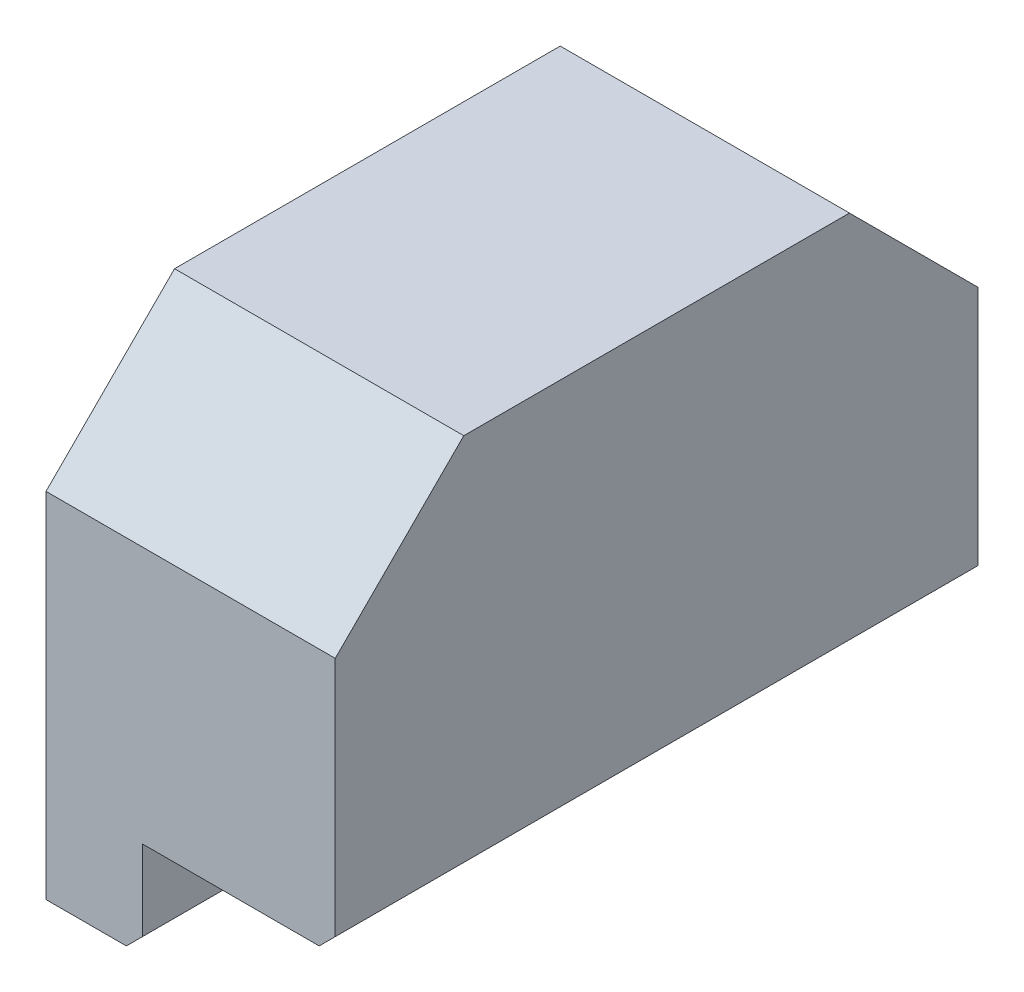
ISO-10303-21;
HEADER;
FILE_DESCRIPTION(('STEP AP214'),'2;1');
FILE_NAME('part.step','',(''),(''),'','','');
FILE_SCHEMA(('AUTOMOTIVE_DESIGN { 1 0 10303 214 1 1 1 1 }'));
ENDSEC;
DATA;
#1=APPLICATION_CONTEXT('core data for automotive mechanical design processes');
#2=APPLICATION_PROTOCOL_DEFINITION('international standard','automotive_design',2000,#1);
#3=PRODUCT_CONTEXT('',#1,'mechanical');
#4=PRODUCT('Part','Part','',(#3));
#5=PRODUCT_RELATED_PRODUCT_CATEGORY('part','',(#4));
#6=PRODUCT_DEFINITION_FORMATION('','',#4);
#7=PRODUCT_DEFINITION_CONTEXT('part definition',#1,'design');
#8=PRODUCT_DEFINITION('design','',#6,#7);
#9=PRODUCT_DEFINITION_SHAPE('','',#8);
#10=(LENGTH_UNIT() NAMED_UNIT(*) SI_UNIT(.MILLI.,.METRE.));
#11=(NAMED_UNIT(*) PLANE_ANGLE_UNIT() SI_UNIT($,.RADIAN.));
#12=(NAMED_UNIT(*) SI_UNIT($,.STERADIAN.) SOLID_ANGLE_UNIT());
#13=UNCERTAINTY_MEASURE_WITH_UNIT(LENGTH_MEASURE(1.E-05),#10,'distance_accuracy_value','');
#14=(GEOMETRIC_REPRESENTATION_CONTEXT(3) GLOBAL_UNCERTAINTY_ASSIGNED_CONTEXT((#13)) GLOBAL_UNIT_ASSIGNED_CONTEXT((#10,
#11,#12)) REPRESENTATION_CONTEXT('',''));
#15=CARTESIAN_POINT('',(0.,0.,0.));
#16=DIRECTION('',(0.,0.,1.));
#17=DIRECTION('',(1.,0.,0.));
#18=AXIS2_PLACEMENT_3D('',#15,#16,#17);
#19=CARTESIAN_POINT('',(0.,0.,20.));
#20=DIRECTION('',(0.,1.,0.));
#21=DIRECTION('',(-1.,0.,0.));
#22=AXIS2_PLACEMENT_3D('',#19,#20,#21);
#23=PLANE('',#22);
#24=DIRECTION('',(1.,0.,0.));
#25=VECTOR('',#24,1.);
#26=CARTESIAN_POINT('',(0.,0.,0.));
#27=LINE('',#26,#25);
#28=CARTESIAN_POINT('',(-3.,0.,0.));
#29=VERTEX_POINT('',#28);
#30=CARTESIAN_POINT('',(-0.5,0.,0.));
#31=VERTEX_POINT('',#30);
#32=EDGE_CURVE('E149',#29,#31,#27,.T.);
#33=ORIENTED_EDGE('',*,*,#32,.T.);
#34=DIRECTION('',(0.,0.,1.));
#35=VECTOR('',#34,1.);
#36=CARTESIAN_POINT('',(-0.5,0.,20.));
#37=LINE('',#36,#35);
#38=CARTESIAN_POINT('',(-0.5,0.,20.));
#39=VERTEX_POINT('',#38);
#40=EDGE_CURVE('E216',#31,#39,#37,.T.);
#41=ORIENTED_EDGE('',*,*,#40,.T.);
#42=DIRECTION('',(1.,0.,0.));
#43=VECTOR('',#42,1.);
#44=CARTESIAN_POINT('',(0.,0.,20.));
#45=LINE('',#44,#43);
#46=CARTESIAN_POINT('',(-3.,0.,20.));
#47=VERTEX_POINT('',#46);
#48=EDGE_CURVE('E150',#47,#39,#45,.T.);
#49=ORIENTED_EDGE('',*,*,#48,.F.);
#50=DIRECTION('',(0.,0.,-1.));
#51=VECTOR('',#50,1.);
#52=CARTESIAN_POINT('',(-3.,0.,20.));
#53=LINE('',#52,#51);
#54=EDGE_CURVE('E162',#47,#29,#53,.T.);
#55=ORIENTED_EDGE('',*,*,#54,.T.);
#56=EDGE_LOOP('',(#33,#41,#49,#55));
#57=FACE_BOUND('',#56,.T.);
#58=ADVANCED_FACE('F39',(#57),#23,.F.);
#59=CARTESIAN_POINT('',(0.,3.,20.));
#60=DIRECTION('',(-1.,0.,0.));
#61=DIRECTION('',(0.,0.,1.));
#62=AXIS2_PLACEMENT_3D('',#59,#60,#61);
#63=PLANE('',#62);
#64=DIRECTION('',(0.,1.,0.));
#65=VECTOR('',#64,1.);
#66=CARTESIAN_POINT('',(0.,3.,20.));
#67=LINE('',#66,#65);
#68=CARTESIAN_POINT('',(0.,0.499999999999997,20.));
#69=VERTEX_POINT('',#68);
#70=CARTESIAN_POINT('',(0.,3.,20.));
#71=VERTEX_POINT('',#70);
#72=EDGE_CURVE('E153',#69,#71,#67,.T.);
#73=ORIENTED_EDGE('',*,*,#72,.F.);
#74=DIRECTION('',(0.,0.,-1.));
#75=VECTOR('',#74,1.);
#76=CARTESIAN_POINT('',(0.,0.499999999999997,20.));
#77=LINE('',#76,#75);
#78=CARTESIAN_POINT('',(0.,0.499999999999997,0.));
#79=VERTEX_POINT('',#78);
#80=EDGE_CURVE('E209',#69,#79,#77,.T.);
#81=ORIENTED_EDGE('',*,*,#80,.T.);
#82=DIRECTION('',(0.,1.,0.));
#83=VECTOR('',#82,1.);
#84=CARTESIAN_POINT('',(0.,3.,0.));
#85=LINE('',#84,#83);
#86=CARTESIAN_POINT('',(0.,3.,0.));
#87=VERTEX_POINT('',#86);
#88=EDGE_CURVE('E165',#79,#87,#85,.T.);
#89=ORIENTED_EDGE('',*,*,#88,.T.);
#90=DIRECTION('',(0.,0.,-1.));
#91=VECTOR('',#90,1.);
#92=CARTESIAN_POINT('',(0.,3.,20.));
#93=LINE('',#92,#91);
#94=EDGE_CURVE('E180',#71,#87,#93,.T.);
#95=ORIENTED_EDGE('',*,*,#94,.F.);
#96=EDGE_LOOP('',(#73,#81,#89,#95));
#97=FACE_BOUND('',#96,.T.);
#98=ADVANCED_FACE('F244',(#97),#63,.F.);
#99=CARTESIAN_POINT('',(0.,3.,20.));
#100=DIRECTION('',(0.,1.,0.));
#101=DIRECTION('',(0.,0.,1.));
#102=AXIS2_PLACEMENT_3D('',#99,#100,#101);
#103=PLANE('',#102);
#104=CARTESIAN_POINT('',(2.5,3.,5.));
#105=DIRECTION('',(0.,-1.,0.));
#106=DIRECTION('',(0.,0.,-1.));
#107=AXIS2_PLACEMENT_3D('',#104,#105,#106);
#108=CIRCLE('',#107,1.24999999999999);
#109=CARTESIAN_POINT('',(2.5,3.,3.75000000000001));
#110=VERTEX_POINT('',#109);
#111=EDGE_CURVE('E133',#110,#110,#108,.T.);
#112=ORIENTED_EDGE('',*,*,#111,.F.);
#113=EDGE_LOOP('',(#112));
#114=FACE_BOUND('',#113,.T.);
#115=CARTESIAN_POINT('',(2.5,3.,15.));
#116=DIRECTION('',(0.,-1.,0.));
#117=DIRECTION('',(0.,0.,-1.));
#118=AXIS2_PLACEMENT_3D('',#115,#116,#117);
#119=CIRCLE('',#118,1.24999999999999);
#120=CARTESIAN_POINT('',(2.5,3.,13.75));
#121=VERTEX_POINT('',#120);
#122=EDGE_CURVE('E132',#121,#121,#119,.T.);
#123=ORIENTED_EDGE('',*,*,#122,.F.);
#124=EDGE_LOOP('',(#123));
#125=FACE_BOUND('',#124,.T.);
#126=DIRECTION('',(1.,0.,0.));
#127=VECTOR('',#126,1.);
#128=CARTESIAN_POINT('',(0.,3.,0.));
#129=LINE('',#128,#127);
#130=CARTESIAN_POINT('',(5.5,3.,0.));
#131=VERTEX_POINT('',#130);
#132=EDGE_CURVE('E167',#87,#131,#129,.T.);
#133=ORIENTED_EDGE('',*,*,#132,.T.);
#134=DIRECTION('',(0.,0.,1.));
#135=VECTOR('',#134,1.);
#136=CARTESIAN_POINT('',(5.5,3.,20.));
#137=LINE('',#136,#135);
#138=CARTESIAN_POINT('',(5.5,3.,20.));
#139=VERTEX_POINT('',#138);
#140=EDGE_CURVE('E54',#131,#139,#137,.T.);
#141=ORIENTED_EDGE('',*,*,#140,.T.);
#142=DIRECTION('',(1.,0.,0.));
#143=VECTOR('',#142,1.);
#144=CARTESIAN_POINT('',(0.,3.,20.));
#145=LINE('',#144,#143);
#146=EDGE_CURVE('E156',#71,#139,#145,.T.);
#147=ORIENTED_EDGE('',*,*,#146,.F.);
#148=ORIENTED_EDGE('',*,*,#94,.T.);
#149=EDGE_LOOP('',(#133,#141,#147,#148));
#150=FACE_BOUND('',#149,.T.);
#151=ADVANCED_FACE('F250',(#114,#125,#150),#103,.F.);
#152=CARTESIAN_POINT('',(6.,3.,20.));
#153=DIRECTION('',(-1.,0.,0.));
#154=DIRECTION('',(0.,0.,1.));
#155=AXIS2_PLACEMENT_3D('',#152,#153,#154);
#156=PLANE('',#155);
#157=DIRECTION('',(0.,1.,0.));
#158=VECTOR('',#157,1.);
#159=CARTESIAN_POINT('',(6.,3.,20.));
#160=LINE('',#159,#158);
#161=CARTESIAN_POINT('',(6.,3.5,20.));
#162=VERTEX_POINT('',#161);
#163=CARTESIAN_POINT('',(6.,11.,20.));
#164=VERTEX_POINT('',#163);
#165=EDGE_CURVE('E158',#162,#164,#160,.T.);
#166=ORIENTED_EDGE('',*,*,#165,.F.);
#167=DIRECTION('',(0.,0.,-1.));
#168=VECTOR('',#167,1.);
#169=CARTESIAN_POINT('',(6.,3.5,20.));
#170=LINE('',#169,#168);
#171=CARTESIAN_POINT('',(6.,3.5,0.));
#172=VERTEX_POINT('',#171);
#173=EDGE_CURVE('E221',#162,#172,#170,.T.);
#174=ORIENTED_EDGE('',*,*,#173,.T.);
#175=DIRECTION('',(0.,1.,0.));
#176=VECTOR('',#175,1.);
#177=CARTESIAN_POINT('',(6.,3.,0.));
#178=LINE('',#177,#176);
#179=CARTESIAN_POINT('',(6.,11.,0.));
#180=VERTEX_POINT('',#179);
#181=EDGE_CURVE('E169',#172,#180,#178,.T.);
#182=ORIENTED_EDGE('',*,*,#181,.T.);
#183=DIRECTION('',(0.,-0.707106781186549,-0.707106781186546));
#184=VECTOR('',#183,1.);
#185=CARTESIAN_POINT('',(6.,15.,4.));
#186=LINE('',#185,#184);
#187=CARTESIAN_POINT('',(6.,15.,4.));
#188=VERTEX_POINT('',#187);
#189=EDGE_CURVE('E195',#180,#188,#186,.F.);
#190=ORIENTED_EDGE('',*,*,#189,.T.);
#191=DIRECTION('',(0.,0.,-1.));
#192=VECTOR('',#191,1.);
#193=CARTESIAN_POINT('',(6.,15.,20.));
#194=LINE('',#193,#192);
#195=CARTESIAN_POINT('',(6.,15.,16.));
#196=VERTEX_POINT('',#195);
#197=EDGE_CURVE('E177',#196,#188,#194,.T.);
#198=ORIENTED_EDGE('',*,*,#197,.F.);
#199=DIRECTION('',(0.,-0.707106781186546,0.707106781186549));
#200=VECTOR('',#199,1.);
#201=CARTESIAN_POINT('',(6.,11.,20.));
#202=LINE('',#201,#200);
#203=EDGE_CURVE('E197',#196,#164,#202,.T.);
#204=ORIENTED_EDGE('',*,*,#203,.T.);
#205=EDGE_LOOP('',(#166,#174,#182,#190,#198,#204));
#206=FACE_BOUND('',#205,.T.);
#207=ADVANCED_FACE('F284',(#206),#156,.F.);
#208=CARTESIAN_POINT('',(6.,15.,20.));
#209=DIRECTION('',(0.,-1.,0.));
#210=DIRECTION('',(1.,0.,0.));
#211=AXIS2_PLACEMENT_3D('',#208,#209,#210);
#212=PLANE('',#211);
#213=DIRECTION('',(0.,0.,-1.));
#214=VECTOR('',#213,1.);
#215=CARTESIAN_POINT('',(-3.,15.,20.));
#216=LINE('',#215,#214);
#217=CARTESIAN_POINT('',(-3.,15.,16.));
#218=VERTEX_POINT('',#217);
#219=CARTESIAN_POINT('',(-3.,15.,4.));
#220=VERTEX_POINT('',#219);
#221=EDGE_CURVE('E174',#218,#220,#216,.T.);
#222=ORIENTED_EDGE('',*,*,#221,.F.);
#223=DIRECTION('',(1.,0.,0.));
#224=VECTOR('',#223,1.);
#225=CARTESIAN_POINT('',(6.,15.,16.));
#226=LINE('',#225,#224);
#227=EDGE_CURVE('E193',#218,#196,#226,.T.);
#228=ORIENTED_EDGE('',*,*,#227,.T.);
#229=ORIENTED_EDGE('',*,*,#197,.T.);
#230=DIRECTION('',(-1.,0.,0.));
#231=VECTOR('',#230,1.);
#232=CARTESIAN_POINT('',(6.,15.,4.));
#233=LINE('',#232,#231);
#234=EDGE_CURVE('E190',#188,#220,#233,.T.);
#235=ORIENTED_EDGE('',*,*,#234,.T.);
#236=EDGE_LOOP('',(#222,#228,#229,#235));
#237=FACE_BOUND('',#236,.T.);
#238=ADVANCED_FACE('F296',(#237),#212,.F.);
#239=CARTESIAN_POINT('',(-3.,15.,20.));
#240=DIRECTION('',(1.,0.,0.));
#241=DIRECTION('',(0.,1.,0.));
#242=AXIS2_PLACEMENT_3D('',#239,#240,#241);
#243=PLANE('',#242);
#244=CARTESIAN_POINT('',(-3.,9.,10.));
#245=DIRECTION('',(1.,0.,0.));
#246=DIRECTION('',(0.,1.,0.));
#247=AXIS2_PLACEMENT_3D('',#244,#245,#246);
#248=CIRCLE('',#247,5.5);
#249=CARTESIAN_POINT('',(-3.,14.5,10.));
#250=VERTEX_POINT('',#249);
#251=EDGE_CURVE('E11',#250,#250,#248,.T.);
#252=ORIENTED_EDGE('',*,*,#251,.T.);
#253=EDGE_LOOP('',(#252));
#254=FACE_BOUND('',#253,.T.);
#255=DIRECTION('',(0.,-1.,0.));
#256=VECTOR('',#255,1.);
#257=CARTESIAN_POINT('',(-3.,15.,20.));
#258=LINE('',#257,#256);
#259=CARTESIAN_POINT('',(-3.,11.,20.));
#260=VERTEX_POINT('',#259);
#261=EDGE_CURVE('E160',#260,#47,#258,.T.);
#262=ORIENTED_EDGE('',*,*,#261,.F.);
#263=DIRECTION('',(0.,0.707106781186546,-0.707106781186549));
#264=VECTOR('',#263,1.);
#265=CARTESIAN_POINT('',(-3.,11.,20.));
#266=LINE('',#265,#264);
#267=EDGE_CURVE('E188',#260,#218,#266,.T.);
#268=ORIENTED_EDGE('',*,*,#267,.T.);
#269=ORIENTED_EDGE('',*,*,#221,.T.);
#270=DIRECTION('',(0.,0.707106781186549,0.707106781186546));
#271=VECTOR('',#270,1.);
#272=CARTESIAN_POINT('',(-3.,15.,4.));
#273=LINE('',#272,#271);
#274=CARTESIAN_POINT('',(-3.,11.,0.));
#275=VERTEX_POINT('',#274);
#276=EDGE_CURVE('E186',#220,#275,#273,.F.);
#277=ORIENTED_EDGE('',*,*,#276,.T.);
#278=DIRECTION('',(0.,-1.,0.));
#279=VECTOR('',#278,1.);
#280=CARTESIAN_POINT('',(-3.,15.,0.));
#281=LINE('',#280,#279);
#282=EDGE_CURVE('E154',#275,#29,#281,.T.);
#283=ORIENTED_EDGE('',*,*,#282,.T.);
#284=ORIENTED_EDGE('',*,*,#54,.F.);
#285=EDGE_LOOP('',(#262,#268,#269,#277,#283,#284));
#286=FACE_BOUND('',#285,.T.);
#287=ADVANCED_FACE('F302',(#254,#286),#243,.F.);
#288=CARTESIAN_POINT('',(0.,0.,20.));
#289=DIRECTION('',(0.,0.,1.));
#290=DIRECTION('',(1.,0.,0.));
#291=AXIS2_PLACEMENT_3D('',#288,#289,#290);
#292=PLANE('',#291);
#293=ORIENTED_EDGE('',*,*,#48,.T.);
#294=DIRECTION('',(-0.70710678118655,-0.707106781186545,0.));
#295=VECTOR('',#294,1.);
#296=CARTESIAN_POINT('',(-0.249999999999999,0.25,20.));
#297=LINE('',#296,#295);
#298=EDGE_CURVE('E219',#39,#69,#297,.F.);
#299=ORIENTED_EDGE('',*,*,#298,.T.);
#300=ORIENTED_EDGE('',*,*,#72,.T.);
#301=ORIENTED_EDGE('',*,*,#146,.T.);
#302=DIRECTION('',(-0.70710678118655,-0.707106781186545,0.));
#303=VECTOR('',#302,1.);
#304=CARTESIAN_POINT('',(1.24999999999998,-1.24999999999999,20.));
#305=LINE('',#304,#303);
#306=EDGE_CURVE('E61',#139,#162,#305,.F.);
#307=ORIENTED_EDGE('',*,*,#306,.T.);
#308=ORIENTED_EDGE('',*,*,#165,.T.);
#309=DIRECTION('',(-1.,0.,0.));
#310=VECTOR('',#309,1.);
#311=CARTESIAN_POINT('',(-3.,11.,20.));
#312=LINE('',#311,#310);
#313=EDGE_CURVE('E183',#164,#260,#312,.T.);
#314=ORIENTED_EDGE('',*,*,#313,.T.);
#315=ORIENTED_EDGE('',*,*,#261,.T.);
#316=EDGE_LOOP('',(#293,#299,#300,#301,#307,#308,#314,#315));
#317=FACE_BOUND('',#316,.T.);
#318=ADVANCED_FACE('F276',(#317),#292,.T.);
#319=CARTESIAN_POINT('',(0.,0.,0.));
#320=DIRECTION('',(0.,0.,1.));
#321=DIRECTION('',(1.,0.,0.));
#322=AXIS2_PLACEMENT_3D('',#319,#320,#321);
#323=PLANE('',#322);
#324=ORIENTED_EDGE('',*,*,#88,.F.);
#325=DIRECTION('',(0.70710678118655,0.707106781186545,0.));
#326=VECTOR('',#325,1.);
#327=CARTESIAN_POINT('',(0.,0.499999999999997,0.));
#328=LINE('',#327,#326);
#329=EDGE_CURVE('E214',#79,#31,#328,.F.);
#330=ORIENTED_EDGE('',*,*,#329,.T.);
#331=ORIENTED_EDGE('',*,*,#32,.F.);
#332=ORIENTED_EDGE('',*,*,#282,.F.);
#333=DIRECTION('',(1.,0.,0.));
#334=VECTOR('',#333,1.);
#335=CARTESIAN_POINT('',(0.,11.,0.));
#336=LINE('',#335,#334);
#337=EDGE_CURVE('E200',#275,#180,#336,.T.);
#338=ORIENTED_EDGE('',*,*,#337,.T.);
#339=ORIENTED_EDGE('',*,*,#181,.F.);
#340=DIRECTION('',(0.70710678118655,0.707106781186545,0.));
#341=VECTOR('',#340,1.);
#342=CARTESIAN_POINT('',(6.,3.5,0.));
#343=LINE('',#342,#341);
#344=EDGE_CURVE('E212',#172,#131,#343,.F.);
#345=ORIENTED_EDGE('',*,*,#344,.T.);
#346=ORIENTED_EDGE('',*,*,#132,.F.);
#347=EDGE_LOOP('',(#324,#330,#331,#332,#338,#339,#345,#346));
#348=FACE_BOUND('',#347,.T.);
#349=ADVANCED_FACE('F286',(#348),#323,.F.);
#350=CARTESIAN_POINT('',(-1.,9.,10.));
#351=DIRECTION('',(-1.,0.,0.));
#352=DIRECTION('',(0.,-1.,0.));
#353=AXIS2_PLACEMENT_3D('',#350,#351,#352);
#354=CYLINDRICAL_SURFACE('',#353,5.);
#355=CARTESIAN_POINT('',(-2.50000000000001,9.,10.));
#356=DIRECTION('',(1.,0.,0.));
#357=DIRECTION('',(0.,0.,-1.));
#358=AXIS2_PLACEMENT_3D('',#355,#356,#357);
#359=CIRCLE('',#358,5.);
#360=CARTESIAN_POINT('',(-2.50000000000001,9.,5.));
#361=VERTEX_POINT('',#360);
#362=EDGE_CURVE('E47',#361,#361,#359,.F.);
#363=ORIENTED_EDGE('',*,*,#362,.T.);
#364=EDGE_LOOP('',(#363));
#365=FACE_BOUND('',#364,.T.);
#366=CARTESIAN_POINT('',(-1.,9.,10.));
#367=DIRECTION('',(-1.,0.,0.));
#368=DIRECTION('',(0.,-1.,0.));
#369=AXIS2_PLACEMENT_3D('',#366,#367,#368);
#370=CIRCLE('',#369,5.);
#371=CARTESIAN_POINT('',(-1.,4.,10.));
#372=VERTEX_POINT('',#371);
#373=EDGE_CURVE('E146',#372,#372,#370,.T.);
#374=ORIENTED_EDGE('',*,*,#373,.F.);
#375=EDGE_LOOP('',(#374));
#376=FACE_BOUND('',#375,.T.);
#377=ADVANCED_FACE('F227',(#365,#376),#354,.F.);
#378=CARTESIAN_POINT('',(-1.,9.,10.));
#379=DIRECTION('',(-1.,0.,0.));
#380=DIRECTION('',(0.,-1.,0.));
#381=AXIS2_PLACEMENT_3D('',#378,#379,#380);
#382=PLANE('',#381);
#383=CARTESIAN_POINT('',(-1.,9.,10.));
#384=DIRECTION('',(-1.,0.,0.));
#385=DIRECTION('',(0.,-1.,0.));
#386=AXIS2_PLACEMENT_3D('',#383,#384,#385);
#387=CIRCLE('',#386,2.);
#388=CARTESIAN_POINT('',(-1.,7.,10.));
#389=VERTEX_POINT('',#388);
#390=EDGE_CURVE('E143',#389,#389,#387,.T.);
#391=ORIENTED_EDGE('',*,*,#390,.F.);
#392=EDGE_LOOP('',(#391));
#393=FACE_BOUND('',#392,.T.);
#394=ORIENTED_EDGE('',*,*,#373,.T.);
#395=EDGE_LOOP('',(#394));
#396=FACE_BOUND('',#395,.T.);
#397=ADVANCED_FACE('F319',(#393,#396),#382,.T.);
#398=CARTESIAN_POINT('',(-1.,9.,10.));
#399=DIRECTION('',(-1.,0.,0.));
#400=DIRECTION('',(0.,-1.,0.));
#401=AXIS2_PLACEMENT_3D('',#398,#399,#400);
#402=CYLINDRICAL_SURFACE('',#401,2.);
#403=CARTESIAN_POINT('',(-2.5,9.,10.));
#404=DIRECTION('',(1.,0.,0.));
#405=DIRECTION('',(0.,0.,-1.));
#406=AXIS2_PLACEMENT_3D('',#403,#404,#405);
#407=CIRCLE('',#406,2.);
#408=CARTESIAN_POINT('',(-2.5,9.,8.));
#409=VERTEX_POINT('',#408);
#410=EDGE_CURVE('E206',#409,#409,#407,.T.);
#411=ORIENTED_EDGE('',*,*,#410,.T.);
#412=EDGE_LOOP('',(#411));
#413=FACE_BOUND('',#412,.T.);
#414=ORIENTED_EDGE('',*,*,#390,.T.);
#415=EDGE_LOOP('',(#414));
#416=FACE_BOUND('',#415,.T.);
#417=ADVANCED_FACE('F314',(#413,#416),#402,.T.);
#418=CARTESIAN_POINT('',(-3.,9.,10.));
#419=DIRECTION('',(1.,0.,0.));
#420=DIRECTION('',(0.,1.,0.));
#421=AXIS2_PLACEMENT_3D('',#418,#419,#420);
#422=CIRCLE('',#421,1.5);
#423=CARTESIAN_POINT('',(-3.,10.5,10.));
#424=VERTEX_POINT('',#423);
#425=EDGE_CURVE('E203',#424,#424,#422,.F.);
#426=ORIENTED_EDGE('',*,*,#425,.T.);
#427=EDGE_LOOP('',(#426));
#428=FACE_BOUND('',#427,.T.);
#429=ADVANCED_FACE('F259',(#428),#243,.F.);
#430=CARTESIAN_POINT('',(0.,11.,20.));
#431=DIRECTION('',(0.,0.707106781186549,0.707106781186546));
#432=DIRECTION('',(1.,0.,0.));
#433=AXIS2_PLACEMENT_3D('',#430,#431,#432);
#434=PLANE('',#433);
#435=ORIENTED_EDGE('',*,*,#203,.F.);
#436=ORIENTED_EDGE('',*,*,#227,.F.);
#437=ORIENTED_EDGE('',*,*,#267,.F.);
#438=ORIENTED_EDGE('',*,*,#313,.F.);
#439=EDGE_LOOP('',(#435,#436,#437,#438));
#440=FACE_BOUND('',#439,.T.);
#441=ADVANCED_FACE('F255',(#440),#434,.T.);
#442=CARTESIAN_POINT('',(6.,15.,4.));
#443=DIRECTION('',(0.,-0.707106781186546,0.707106781186549));
#444=DIRECTION('',(-1.,0.,0.));
#445=AXIS2_PLACEMENT_3D('',#442,#443,#444);
#446=PLANE('',#445);
#447=ORIENTED_EDGE('',*,*,#189,.F.);
#448=ORIENTED_EDGE('',*,*,#337,.F.);
#449=ORIENTED_EDGE('',*,*,#276,.F.);
#450=ORIENTED_EDGE('',*,*,#234,.F.);
#451=EDGE_LOOP('',(#447,#448,#449,#450));
#452=FACE_BOUND('',#451,.T.);
#453=ADVANCED_FACE('F258',(#452),#446,.F.);
#454=CARTESIAN_POINT('',(-3.,9.,10.));
#455=DIRECTION('',(1.,0.,0.));
#456=DIRECTION('',(0.,0.,-1.));
#457=AXIS2_PLACEMENT_3D('',#454,#455,#456);
#458=CONICAL_SURFACE('',#457,1.5,0.785398163397448);
#459=ORIENTED_EDGE('',*,*,#410,.F.);
#460=EDGE_LOOP('',(#459));
#461=FACE_BOUND('',#460,.T.);
#462=ORIENTED_EDGE('',*,*,#425,.F.);
#463=EDGE_LOOP('',(#462));
#464=FACE_BOUND('',#463,.T.);
#465=ADVANCED_FACE('F263',(#461,#464),#458,.T.);
#466=CARTESIAN_POINT('',(0.,0.499999999999997,20.));
#467=DIRECTION('',(-0.707106781186545,0.70710678118655,0.));
#468=DIRECTION('',(0.,0.,-1.));
#469=AXIS2_PLACEMENT_3D('',#466,#467,#468);
#470=PLANE('',#469);
#471=ORIENTED_EDGE('',*,*,#298,.F.);
#472=ORIENTED_EDGE('',*,*,#40,.F.);
#473=ORIENTED_EDGE('',*,*,#329,.F.);
#474=ORIENTED_EDGE('',*,*,#80,.F.);
#475=EDGE_LOOP('',(#471,#472,#473,#474));
#476=FACE_BOUND('',#475,.T.);
#477=ADVANCED_FACE('F240',(#476),#470,.F.);
#478=CARTESIAN_POINT('',(6.,3.5,20.));
#479=DIRECTION('',(-0.707106781186545,0.70710678118655,0.));
#480=DIRECTION('',(0.,0.,-1.));
#481=AXIS2_PLACEMENT_3D('',#478,#479,#480);
#482=PLANE('',#481);
#483=ORIENTED_EDGE('',*,*,#306,.F.);
#484=ORIENTED_EDGE('',*,*,#140,.F.);
#485=ORIENTED_EDGE('',*,*,#344,.F.);
#486=ORIENTED_EDGE('',*,*,#173,.F.);
#487=EDGE_LOOP('',(#483,#484,#485,#486));
#488=FACE_BOUND('',#487,.T.);
#489=ADVANCED_FACE('F232',(#488),#482,.F.);
#490=CARTESIAN_POINT('',(-2.50000000000001,9.,10.));
#491=DIRECTION('',(-1.,0.,0.));
#492=DIRECTION('',(0.,0.,1.));
#493=AXIS2_PLACEMENT_3D('',#490,#491,#492);
#494=CONICAL_SURFACE('',#493,5.,0.785398163397456);
#495=ORIENTED_EDGE('',*,*,#251,.F.);
#496=EDGE_LOOP('',(#495));
#497=FACE_BOUND('',#496,.T.);
#498=ORIENTED_EDGE('',*,*,#362,.F.);
#499=EDGE_LOOP('',(#498));
#500=FACE_BOUND('',#499,.T.);
#501=ADVANCED_FACE('F41',(#497,#500),#494,.F.);
#502=CARTESIAN_POINT('',(2.5,10.5,15.));
#503=DIRECTION('',(0.,-1.,0.));
#504=DIRECTION('',(0.,0.,-1.));
#505=AXIS2_PLACEMENT_3D('',#502,#503,#504);
#506=CONICAL_SURFACE('',#505,1.24999999999999,1.02974425867664);
#507=CARTESIAN_POINT('',(2.5,11.2510757737845,15.));
#508=VERTEX_POINT('',#507);
#509=VERTEX_LOOP('',#508);
#510=FACE_BOUND('',#509,.T.);
#511=CARTESIAN_POINT('',(2.5,10.5,15.));
#512=DIRECTION('',(0.,-1.,0.));
#513=DIRECTION('',(0.,0.,-1.));
#514=AXIS2_PLACEMENT_3D('',#511,#512,#513);
#515=CIRCLE('',#514,1.24999999999999);
#516=CARTESIAN_POINT('',(2.5,10.5,13.75));
#517=VERTEX_POINT('',#516);
#518=EDGE_CURVE('E136',#517,#517,#515,.T.);
#519=ORIENTED_EDGE('',*,*,#518,.T.);
#520=EDGE_LOOP('',(#519));
#521=FACE_BOUND('',#520,.T.);
#522=ADVANCED_FACE('F231',(#510,#521),#506,.F.);
#523=CARTESIAN_POINT('',(2.5,3.,15.));
#524=DIRECTION('',(0.,-1.,0.));
#525=DIRECTION('',(0.,0.,-1.));
#526=AXIS2_PLACEMENT_3D('',#523,#524,#525);
#527=CYLINDRICAL_SURFACE('',#526,1.24999999999999);
#528=ORIENTED_EDGE('',*,*,#518,.F.);
#529=EDGE_LOOP('',(#528));
#530=FACE_BOUND('',#529,.T.);
#531=ORIENTED_EDGE('',*,*,#122,.T.);
#532=EDGE_LOOP('',(#531));
#533=FACE_BOUND('',#532,.T.);
#534=ADVANCED_FACE('F126',(#530,#533),#527,.F.);
#535=CARTESIAN_POINT('',(2.5,10.5,5.));
#536=DIRECTION('',(0.,-1.,0.));
#537=DIRECTION('',(0.,0.,-1.));
#538=AXIS2_PLACEMENT_3D('',#535,#536,#537);
#539=CONICAL_SURFACE('',#538,1.24999999999999,1.02974425867664);
#540=CARTESIAN_POINT('',(2.5,11.2510757737845,5.));
#541=VERTEX_POINT('',#540);
#542=VERTEX_LOOP('',#541);
#543=FACE_BOUND('',#542,.T.);
#544=CARTESIAN_POINT('',(2.5,10.5,5.));
#545=DIRECTION('',(0.,-1.,0.));
#546=DIRECTION('',(0.,0.,-1.));
#547=AXIS2_PLACEMENT_3D('',#544,#545,#546);
#548=CIRCLE('',#547,1.24999999999999);
#549=CARTESIAN_POINT('',(2.5,10.5,3.75000000000001));
#550=VERTEX_POINT('',#549);
#551=EDGE_CURVE('E130',#550,#550,#548,.T.);
#552=ORIENTED_EDGE('',*,*,#551,.T.);
#553=EDGE_LOOP('',(#552));
#554=FACE_BOUND('',#553,.T.);
#555=ADVANCED_FACE('F122',(#543,#554),#539,.F.);
#556=CARTESIAN_POINT('',(2.5,3.,5.));
#557=DIRECTION('',(0.,-1.,0.));
#558=DIRECTION('',(0.,0.,-1.));
#559=AXIS2_PLACEMENT_3D('',#556,#557,#558);
#560=CYLINDRICAL_SURFACE('',#559,1.24999999999999);
#561=ORIENTED_EDGE('',*,*,#551,.F.);
#562=EDGE_LOOP('',(#561));
#563=FACE_BOUND('',#562,.T.);
#564=ORIENTED_EDGE('',*,*,#111,.T.);
#565=EDGE_LOOP('',(#564));
#566=FACE_BOUND('',#565,.T.);
#567=ADVANCED_FACE('F125',(#563,#566),#560,.F.);
#568=CLOSED_SHELL('',(#58,#98,#151,#207,#238,#287,#318,#349,#377,#397,#417,#429,#441,#453,#465,
#477,#489,#501,#522,#534,#555,#567));
#569=MANIFOLD_SOLID_BREP('B2',#568);
#570=ADVANCED_BREP_SHAPE_REPRESENTATION('',(#18,#569),#14);
#571=SHAPE_DEFINITION_REPRESENTATION(#9,#570);
ENDSEC;
END-ISO-10303-21;
